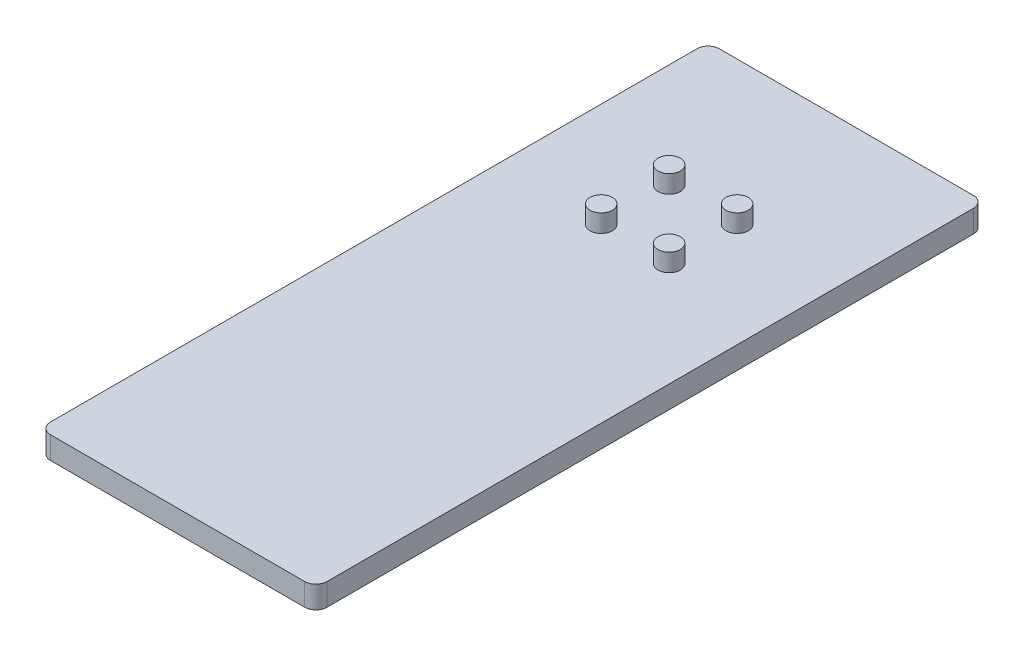
ISO-10303-21;
HEADER;
FILE_DESCRIPTION(('STEP AP214'),'2;1');
FILE_NAME('part.step','',(''),(''),'','','');
FILE_SCHEMA(('AUTOMOTIVE_DESIGN { 1 0 10303 214 1 1 1 1 }'));
ENDSEC;
DATA;
#1=APPLICATION_CONTEXT('core data for automotive mechanical design processes');
#2=APPLICATION_PROTOCOL_DEFINITION('international standard','automotive_design',2000,#1);
#3=PRODUCT_CONTEXT('',#1,'mechanical');
#4=PRODUCT('Part','Part','',(#3));
#5=PRODUCT_RELATED_PRODUCT_CATEGORY('part','',(#4));
#6=PRODUCT_DEFINITION_FORMATION('','',#4);
#7=PRODUCT_DEFINITION_CONTEXT('part definition',#1,'design');
#8=PRODUCT_DEFINITION('design','',#6,#7);
#9=PRODUCT_DEFINITION_SHAPE('','',#8);
#10=(LENGTH_UNIT() NAMED_UNIT(*) SI_UNIT(.MILLI.,.METRE.));
#11=(NAMED_UNIT(*) PLANE_ANGLE_UNIT() SI_UNIT($,.RADIAN.));
#12=(NAMED_UNIT(*) SI_UNIT($,.STERADIAN.) SOLID_ANGLE_UNIT());
#13=UNCERTAINTY_MEASURE_WITH_UNIT(LENGTH_MEASURE(1.E-05),#10,'distance_accuracy_value','');
#14=(GEOMETRIC_REPRESENTATION_CONTEXT(3) GLOBAL_UNCERTAINTY_ASSIGNED_CONTEXT((#13)) GLOBAL_UNIT_ASSIGNED_CONTEXT((#10,
#11,#12)) REPRESENTATION_CONTEXT('',''));
#15=CARTESIAN_POINT('',(0.,0.,0.));
#16=DIRECTION('',(0.,0.,1.));
#17=DIRECTION('',(1.,0.,0.));
#18=AXIS2_PLACEMENT_3D('',#15,#16,#17);
#19=CARTESIAN_POINT('',(31.,5.,-75.0000000000002));
#20=DIRECTION('',(-1.,0.,0.));
#21=DIRECTION('',(0.,0.,1.));
#22=AXIS2_PLACEMENT_3D('',#19,#20,#21);
#23=PLANE('',#22);
#24=DIRECTION('',(0.,0.,-1.));
#25=VECTOR('',#24,1.);
#26=CARTESIAN_POINT('',(31.,0.,-75.0000000000002));
#27=LINE('',#26,#25);
#28=CARTESIAN_POINT('',(30.9999999999999,0.,72.4999999999998));
#29=VERTEX_POINT('',#28);
#30=CARTESIAN_POINT('',(31.,0.,-72.5000000000001));
#31=VERTEX_POINT('',#30);
#32=EDGE_CURVE('E146',#29,#31,#27,.T.);
#33=ORIENTED_EDGE('',*,*,#32,.T.);
#34=DIRECTION('',(0.,-1.,0.));
#35=VECTOR('',#34,1.);
#36=CARTESIAN_POINT('',(31.,5.,-72.5000000000001));
#37=LINE('',#36,#35);
#38=CARTESIAN_POINT('',(31.,5.,-72.5000000000001));
#39=VERTEX_POINT('',#38);
#40=EDGE_CURVE('E180',#31,#39,#37,.F.);
#41=ORIENTED_EDGE('',*,*,#40,.T.);
#42=DIRECTION('',(0.,0.,-1.));
#43=VECTOR('',#42,1.);
#44=CARTESIAN_POINT('',(31.,5.,-75.0000000000002));
#45=LINE('',#44,#43);
#46=CARTESIAN_POINT('',(30.9999999999999,5.,72.4999999999998));
#47=VERTEX_POINT('',#46);
#48=EDGE_CURVE('E144',#47,#39,#45,.T.);
#49=ORIENTED_EDGE('',*,*,#48,.F.);
#50=DIRECTION('',(0.,-1.,0.));
#51=VECTOR('',#50,1.);
#52=CARTESIAN_POINT('',(30.9999999999999,5.,72.4999999999998));
#53=LINE('',#52,#51);
#54=EDGE_CURVE('E176',#47,#29,#53,.T.);
#55=ORIENTED_EDGE('',*,*,#54,.T.);
#56=EDGE_LOOP('',(#33,#41,#49,#55));
#57=FACE_BOUND('',#56,.T.);
#58=ADVANCED_FACE('F45',(#57),#23,.F.);
#59=CARTESIAN_POINT('',(-31.0000000000001,5.,-75.0000000000002));
#60=DIRECTION('',(0.,0.,1.));
#61=DIRECTION('',(1.,0.,0.));
#62=AXIS2_PLACEMENT_3D('',#59,#60,#61);
#63=PLANE('',#62);
#64=DIRECTION('',(-1.,0.,0.));
#65=VECTOR('',#64,1.);
#66=CARTESIAN_POINT('',(-31.0000000000001,0.,-75.0000000000002));
#67=LINE('',#66,#65);
#68=CARTESIAN_POINT('',(28.5,0.,-75.0000000000002));
#69=VERTEX_POINT('',#68);
#70=CARTESIAN_POINT('',(-28.5000000000001,0.,-75.0000000000002));
#71=VERTEX_POINT('',#70);
#72=EDGE_CURVE('E140',#69,#71,#67,.T.);
#73=ORIENTED_EDGE('',*,*,#72,.T.);
#74=DIRECTION('',(0.,-1.,0.));
#75=VECTOR('',#74,1.);
#76=CARTESIAN_POINT('',(-28.5000000000001,5.,-75.0000000000002));
#77=LINE('',#76,#75);
#78=CARTESIAN_POINT('',(-28.5000000000001,5.,-75.0000000000002));
#79=VERTEX_POINT('',#78);
#80=EDGE_CURVE('E116',#71,#79,#77,.F.);
#81=ORIENTED_EDGE('',*,*,#80,.T.);
#82=DIRECTION('',(-1.,0.,0.));
#83=VECTOR('',#82,1.);
#84=CARTESIAN_POINT('',(-31.0000000000001,5.,-75.0000000000002));
#85=LINE('',#84,#83);
#86=CARTESIAN_POINT('',(28.5,5.,-75.0000000000002));
#87=VERTEX_POINT('',#86);
#88=EDGE_CURVE('E199',#87,#79,#85,.T.);
#89=ORIENTED_EDGE('',*,*,#88,.F.);
#90=DIRECTION('',(0.,-1.,0.));
#91=VECTOR('',#90,1.);
#92=CARTESIAN_POINT('',(28.5,5.,-75.0000000000002));
#93=LINE('',#92,#91);
#94=EDGE_CURVE('E122',#87,#69,#93,.T.);
#95=ORIENTED_EDGE('',*,*,#94,.T.);
#96=EDGE_LOOP('',(#73,#81,#89,#95));
#97=FACE_BOUND('',#96,.T.);
#98=ADVANCED_FACE('F256',(#97),#63,.F.);
#99=CARTESIAN_POINT('',(-31.0000000000001,5.,-75.0000000000002));
#100=DIRECTION('',(1.,0.,0.));
#101=DIRECTION('',(0.,0.,-1.));
#102=AXIS2_PLACEMENT_3D('',#99,#100,#101);
#103=PLANE('',#102);
#104=DIRECTION('',(0.,0.,1.));
#105=VECTOR('',#104,1.);
#106=CARTESIAN_POINT('',(-31.0000000000001,5.,-75.0000000000002));
#107=LINE('',#106,#105);
#108=CARTESIAN_POINT('',(-31.0000000000001,5.,-72.5000000000001));
#109=VERTEX_POINT('',#108);
#110=CARTESIAN_POINT('',(-31.0000000000001,5.,72.4999999999998));
#111=VERTEX_POINT('',#110);
#112=EDGE_CURVE('E131',#109,#111,#107,.T.);
#113=ORIENTED_EDGE('',*,*,#112,.F.);
#114=DIRECTION('',(0.,-1.,0.));
#115=VECTOR('',#114,1.);
#116=CARTESIAN_POINT('',(-31.0000000000001,5.,-72.5000000000001));
#117=LINE('',#116,#115);
#118=CARTESIAN_POINT('',(-31.0000000000001,0.,-72.5000000000001));
#119=VERTEX_POINT('',#118);
#120=EDGE_CURVE('E115',#109,#119,#117,.T.);
#121=ORIENTED_EDGE('',*,*,#120,.T.);
#122=DIRECTION('',(0.,0.,1.));
#123=VECTOR('',#122,1.);
#124=CARTESIAN_POINT('',(-31.0000000000001,0.,-75.0000000000002));
#125=LINE('',#124,#123);
#126=CARTESIAN_POINT('',(-31.0000000000001,0.,72.4999999999998));
#127=VERTEX_POINT('',#126);
#128=EDGE_CURVE('E129',#119,#127,#125,.T.);
#129=ORIENTED_EDGE('',*,*,#128,.T.);
#130=DIRECTION('',(0.,-1.,0.));
#131=VECTOR('',#130,1.);
#132=CARTESIAN_POINT('',(-31.0000000000001,5.,72.4999999999998));
#133=LINE('',#132,#131);
#134=EDGE_CURVE('E134',#127,#111,#133,.F.);
#135=ORIENTED_EDGE('',*,*,#134,.T.);
#136=EDGE_LOOP('',(#113,#121,#129,#135));
#137=FACE_BOUND('',#136,.T.);
#138=ADVANCED_FACE('F128',(#137),#103,.F.);
#139=CARTESIAN_POINT('',(-31.0000000000001,5.,74.9999999999998));
#140=DIRECTION('',(0.,0.,-1.));
#141=DIRECTION('',(-1.,0.,0.));
#142=AXIS2_PLACEMENT_3D('',#139,#140,#141);
#143=PLANE('',#142);
#144=DIRECTION('',(1.,0.,0.));
#145=VECTOR('',#144,1.);
#146=CARTESIAN_POINT('',(-31.0000000000001,0.,74.9999999999998));
#147=LINE('',#146,#145);
#148=CARTESIAN_POINT('',(-28.5000000000001,0.,74.9999999999998));
#149=VERTEX_POINT('',#148);
#150=CARTESIAN_POINT('',(28.4999999999999,0.,74.9999999999998));
#151=VERTEX_POINT('',#150);
#152=EDGE_CURVE('E139',#149,#151,#147,.T.);
#153=ORIENTED_EDGE('',*,*,#152,.T.);
#154=DIRECTION('',(0.,-1.,0.));
#155=VECTOR('',#154,1.);
#156=CARTESIAN_POINT('',(28.4999999999999,5.,74.9999999999998));
#157=LINE('',#156,#155);
#158=CARTESIAN_POINT('',(28.4999999999999,5.,74.9999999999998));
#159=VERTEX_POINT('',#158);
#160=EDGE_CURVE('E11',#151,#159,#157,.F.);
#161=ORIENTED_EDGE('',*,*,#160,.T.);
#162=DIRECTION('',(1.,0.,0.));
#163=VECTOR('',#162,1.);
#164=CARTESIAN_POINT('',(-31.0000000000001,5.,74.9999999999998));
#165=LINE('',#164,#163);
#166=CARTESIAN_POINT('',(-28.5000000000001,5.,74.9999999999998));
#167=VERTEX_POINT('',#166);
#168=EDGE_CURVE('E151',#167,#159,#165,.T.);
#169=ORIENTED_EDGE('',*,*,#168,.F.);
#170=DIRECTION('',(0.,-1.,0.));
#171=VECTOR('',#170,1.);
#172=CARTESIAN_POINT('',(-28.5000000000001,5.,74.9999999999998));
#173=LINE('',#172,#171);
#174=EDGE_CURVE('E54',#167,#149,#173,.T.);
#175=ORIENTED_EDGE('',*,*,#174,.T.);
#176=EDGE_LOOP('',(#153,#161,#169,#175));
#177=FACE_BOUND('',#176,.T.);
#178=ADVANCED_FACE('F185',(#177),#143,.F.);
#179=CARTESIAN_POINT('',(0.,5.,0.));
#180=DIRECTION('',(0.,1.,0.));
#181=DIRECTION('',(0.,0.,1.));
#182=AXIS2_PLACEMENT_3D('',#179,#180,#181);
#183=PLANE('',#182);
#184=CARTESIAN_POINT('',(-7.62499999999967,5.,-27.6250000000005));
#185=DIRECTION('',(0.,1.,0.));
#186=DIRECTION('',(0.,0.,1.));
#187=AXIS2_PLACEMENT_3D('',#184,#185,#186);
#188=CIRCLE('',#187,2.5);
#189=CARTESIAN_POINT('',(-7.62499999999967,5.,-25.1250000000005));
#190=VERTEX_POINT('',#189);
#191=EDGE_CURVE('E225',#190,#190,#188,.T.);
#192=ORIENTED_EDGE('',*,*,#191,.F.);
#193=EDGE_LOOP('',(#192));
#194=FACE_BOUND('',#193,.T.);
#195=CARTESIAN_POINT('',(7.62499999999972,5.,-27.6250000000003));
#196=DIRECTION('',(0.,1.,0.));
#197=DIRECTION('',(0.,0.,1.));
#198=AXIS2_PLACEMENT_3D('',#195,#196,#197);
#199=CIRCLE('',#198,2.49999999999945);
#200=CARTESIAN_POINT('',(7.62499999999972,5.,-25.1250000000009));
#201=VERTEX_POINT('',#200);
#202=EDGE_CURVE('E233',#201,#201,#199,.T.);
#203=ORIENTED_EDGE('',*,*,#202,.F.);
#204=EDGE_LOOP('',(#203));
#205=FACE_BOUND('',#204,.T.);
#206=CARTESIAN_POINT('',(7.62499999999984,5.,-42.8750000000006));
#207=DIRECTION('',(0.,1.,0.));
#208=DIRECTION('',(0.,0.,1.));
#209=AXIS2_PLACEMENT_3D('',#206,#207,#208);
#210=CIRCLE('',#209,2.5);
#211=CARTESIAN_POINT('',(7.62499999999984,5.,-40.3750000000006));
#212=VERTEX_POINT('',#211);
#213=EDGE_CURVE('E219',#212,#212,#210,.T.);
#214=ORIENTED_EDGE('',*,*,#213,.F.);
#215=EDGE_LOOP('',(#214));
#216=FACE_BOUND('',#215,.T.);
#217=CARTESIAN_POINT('',(-7.625,5.,-42.8750000000002));
#218=DIRECTION('',(0.,1.,0.));
#219=DIRECTION('',(0.,0.,1.));
#220=AXIS2_PLACEMENT_3D('',#217,#218,#219);
#221=CIRCLE('',#220,2.5);
#222=CARTESIAN_POINT('',(-7.625,5.,-40.3750000000002));
#223=VERTEX_POINT('',#222);
#224=EDGE_CURVE('E205',#223,#223,#221,.T.);
#225=ORIENTED_EDGE('',*,*,#224,.F.);
#226=EDGE_LOOP('',(#225));
#227=FACE_BOUND('',#226,.T.);
#228=ORIENTED_EDGE('',*,*,#88,.T.);
#229=CARTESIAN_POINT('',(-28.5000000000001,5.,-72.5000000000001));
#230=DIRECTION('',(0.,1.,0.));
#231=DIRECTION('',(0.,0.,1.));
#232=AXIS2_PLACEMENT_3D('',#229,#230,#231);
#233=CIRCLE('',#232,2.5);
#234=EDGE_CURVE('E173',#79,#109,#233,.T.);
#235=ORIENTED_EDGE('',*,*,#234,.T.);
#236=ORIENTED_EDGE('',*,*,#112,.T.);
#237=CARTESIAN_POINT('',(-28.5000000000001,5.,72.4999999999998));
#238=DIRECTION('',(0.,1.,0.));
#239=DIRECTION('',(0.,0.,1.));
#240=AXIS2_PLACEMENT_3D('',#237,#238,#239);
#241=CIRCLE('',#240,2.5);
#242=EDGE_CURVE('E66',#111,#167,#241,.T.);
#243=ORIENTED_EDGE('',*,*,#242,.T.);
#244=ORIENTED_EDGE('',*,*,#168,.T.);
#245=CARTESIAN_POINT('',(28.4999999999999,5.,72.4999999999998));
#246=DIRECTION('',(0.,1.,0.));
#247=DIRECTION('',(0.,0.,1.));
#248=AXIS2_PLACEMENT_3D('',#245,#246,#247);
#249=CIRCLE('',#248,2.5);
#250=EDGE_CURVE('E167',#159,#47,#249,.T.);
#251=ORIENTED_EDGE('',*,*,#250,.T.);
#252=ORIENTED_EDGE('',*,*,#48,.T.);
#253=CARTESIAN_POINT('',(28.5,5.,-72.5000000000001));
#254=DIRECTION('',(0.,1.,0.));
#255=DIRECTION('',(0.,0.,1.));
#256=AXIS2_PLACEMENT_3D('',#253,#254,#255);
#257=CIRCLE('',#256,2.5);
#258=EDGE_CURVE('E170',#39,#87,#257,.T.);
#259=ORIENTED_EDGE('',*,*,#258,.T.);
#260=EDGE_LOOP('',(#228,#235,#236,#243,#244,#251,#252,#259));
#261=FACE_BOUND('',#260,.T.);
#262=ADVANCED_FACE('F247',(#194,#205,#216,#227,#261),#183,.T.);
#263=CARTESIAN_POINT('',(0.,0.,0.));
#264=DIRECTION('',(0.,1.,0.));
#265=DIRECTION('',(0.,0.,1.));
#266=AXIS2_PLACEMENT_3D('',#263,#264,#265);
#267=PLANE('',#266);
#268=ORIENTED_EDGE('',*,*,#128,.F.);
#269=CARTESIAN_POINT('',(-28.5000000000001,0.,-72.5000000000001));
#270=DIRECTION('',(0.,1.,0.));
#271=DIRECTION('',(0.,0.,1.));
#272=AXIS2_PLACEMENT_3D('',#269,#270,#271);
#273=CIRCLE('',#272,2.5);
#274=EDGE_CURVE('E111',#119,#71,#273,.F.);
#275=ORIENTED_EDGE('',*,*,#274,.T.);
#276=ORIENTED_EDGE('',*,*,#72,.F.);
#277=CARTESIAN_POINT('',(28.5,0.,-72.5000000000001));
#278=DIRECTION('',(0.,1.,0.));
#279=DIRECTION('',(0.,0.,1.));
#280=AXIS2_PLACEMENT_3D('',#277,#278,#279);
#281=CIRCLE('',#280,2.5);
#282=EDGE_CURVE('E123',#69,#31,#281,.F.);
#283=ORIENTED_EDGE('',*,*,#282,.T.);
#284=ORIENTED_EDGE('',*,*,#32,.F.);
#285=CARTESIAN_POINT('',(28.4999999999999,0.,72.4999999999998));
#286=DIRECTION('',(0.,1.,0.));
#287=DIRECTION('',(0.,0.,1.));
#288=AXIS2_PLACEMENT_3D('',#285,#286,#287);
#289=CIRCLE('',#288,2.5);
#290=EDGE_CURVE('E155',#29,#151,#289,.F.);
#291=ORIENTED_EDGE('',*,*,#290,.T.);
#292=ORIENTED_EDGE('',*,*,#152,.F.);
#293=CARTESIAN_POINT('',(-28.5000000000001,0.,72.4999999999998));
#294=DIRECTION('',(0.,1.,0.));
#295=DIRECTION('',(0.,0.,1.));
#296=AXIS2_PLACEMENT_3D('',#293,#294,#295);
#297=CIRCLE('',#296,2.5);
#298=EDGE_CURVE('E133',#149,#127,#297,.F.);
#299=ORIENTED_EDGE('',*,*,#298,.T.);
#300=EDGE_LOOP('',(#268,#275,#276,#283,#284,#291,#292,#299));
#301=FACE_BOUND('',#300,.T.);
#302=ADVANCED_FACE('F136',(#301),#267,.F.);
#303=CARTESIAN_POINT('',(-28.5000000000001,5.,-72.5000000000001));
#304=DIRECTION('',(0.,-1.,0.));
#305=DIRECTION('',(0.,0.,-1.));
#306=AXIS2_PLACEMENT_3D('',#303,#304,#305);
#307=CYLINDRICAL_SURFACE('',#306,2.5);
#308=ORIENTED_EDGE('',*,*,#234,.F.);
#309=ORIENTED_EDGE('',*,*,#80,.F.);
#310=ORIENTED_EDGE('',*,*,#274,.F.);
#311=ORIENTED_EDGE('',*,*,#120,.F.);
#312=EDGE_LOOP('',(#308,#309,#310,#311));
#313=FACE_BOUND('',#312,.T.);
#314=ADVANCED_FACE('F114',(#313),#307,.T.);
#315=CARTESIAN_POINT('',(28.5,5.,-72.5000000000001));
#316=DIRECTION('',(0.,-1.,0.));
#317=DIRECTION('',(0.,0.,-1.));
#318=AXIS2_PLACEMENT_3D('',#315,#316,#317);
#319=CYLINDRICAL_SURFACE('',#318,2.5);
#320=ORIENTED_EDGE('',*,*,#258,.F.);
#321=ORIENTED_EDGE('',*,*,#40,.F.);
#322=ORIENTED_EDGE('',*,*,#282,.F.);
#323=ORIENTED_EDGE('',*,*,#94,.F.);
#324=EDGE_LOOP('',(#320,#321,#322,#323));
#325=FACE_BOUND('',#324,.T.);
#326=ADVANCED_FACE('F258',(#325),#319,.T.);
#327=CARTESIAN_POINT('',(28.4999999999999,5.,72.4999999999998));
#328=DIRECTION('',(0.,-1.,0.));
#329=DIRECTION('',(0.,0.,-1.));
#330=AXIS2_PLACEMENT_3D('',#327,#328,#329);
#331=CYLINDRICAL_SURFACE('',#330,2.5);
#332=ORIENTED_EDGE('',*,*,#250,.F.);
#333=ORIENTED_EDGE('',*,*,#160,.F.);
#334=ORIENTED_EDGE('',*,*,#290,.F.);
#335=ORIENTED_EDGE('',*,*,#54,.F.);
#336=EDGE_LOOP('',(#332,#333,#334,#335));
#337=FACE_BOUND('',#336,.T.);
#338=ADVANCED_FACE('F192',(#337),#331,.T.);
#339=CARTESIAN_POINT('',(-28.5000000000001,5.,72.4999999999998));
#340=DIRECTION('',(0.,-1.,0.));
#341=DIRECTION('',(0.,0.,-1.));
#342=AXIS2_PLACEMENT_3D('',#339,#340,#341);
#343=CYLINDRICAL_SURFACE('',#342,2.5);
#344=ORIENTED_EDGE('',*,*,#242,.F.);
#345=ORIENTED_EDGE('',*,*,#134,.F.);
#346=ORIENTED_EDGE('',*,*,#298,.F.);
#347=ORIENTED_EDGE('',*,*,#174,.F.);
#348=EDGE_LOOP('',(#344,#345,#346,#347));
#349=FACE_BOUND('',#348,.T.);
#350=ADVANCED_FACE('F47',(#349),#343,.T.);
#351=CARTESIAN_POINT('',(-7.625,9.,-42.8750000000002));
#352=DIRECTION('',(0.,-1.,0.));
#353=DIRECTION('',(0.,0.,-1.));
#354=AXIS2_PLACEMENT_3D('',#351,#352,#353);
#355=CYLINDRICAL_SURFACE('',#354,2.5);
#356=CARTESIAN_POINT('',(-7.625,9.,-42.8750000000002));
#357=DIRECTION('',(0.,1.,0.));
#358=DIRECTION('',(0.,0.,1.));
#359=AXIS2_PLACEMENT_3D('',#356,#357,#358);
#360=CIRCLE('',#359,2.5);
#361=CARTESIAN_POINT('',(-7.625,9.,-40.3750000000002));
#362=VERTEX_POINT('',#361);
#363=EDGE_CURVE('E212',#362,#362,#360,.T.);
#364=ORIENTED_EDGE('',*,*,#363,.F.);
#365=EDGE_LOOP('',(#364));
#366=FACE_BOUND('',#365,.T.);
#367=ORIENTED_EDGE('',*,*,#224,.T.);
#368=EDGE_LOOP('',(#367));
#369=FACE_BOUND('',#368,.T.);
#370=ADVANCED_FACE('F279',(#366,#369),#355,.T.);
#371=CARTESIAN_POINT('',(-7.625,9.,-42.8750000000002));
#372=DIRECTION('',(0.,1.,0.));
#373=DIRECTION('',(0.,0.,1.));
#374=AXIS2_PLACEMENT_3D('',#371,#372,#373);
#375=PLANE('',#374);
#376=ORIENTED_EDGE('',*,*,#363,.T.);
#377=EDGE_LOOP('',(#376));
#378=FACE_BOUND('',#377,.T.);
#379=ADVANCED_FACE('F282',(#378),#375,.T.);
#380=CARTESIAN_POINT('',(7.62499999999984,9.,-42.8750000000006));
#381=DIRECTION('',(0.,-1.,0.));
#382=DIRECTION('',(0.,0.,-1.));
#383=AXIS2_PLACEMENT_3D('',#380,#381,#382);
#384=CYLINDRICAL_SURFACE('',#383,2.5);
#385=CARTESIAN_POINT('',(7.62499999999984,9.,-42.8750000000006));
#386=DIRECTION('',(0.,1.,0.));
#387=DIRECTION('',(0.,0.,1.));
#388=AXIS2_PLACEMENT_3D('',#385,#386,#387);
#389=CIRCLE('',#388,2.5);
#390=CARTESIAN_POINT('',(7.62499999999984,9.,-40.3750000000006));
#391=VERTEX_POINT('',#390);
#392=EDGE_CURVE('E237',#391,#391,#389,.T.);
#393=ORIENTED_EDGE('',*,*,#392,.F.);
#394=EDGE_LOOP('',(#393));
#395=FACE_BOUND('',#394,.T.);
#396=ORIENTED_EDGE('',*,*,#213,.T.);
#397=EDGE_LOOP('',(#396));
#398=FACE_BOUND('',#397,.T.);
#399=ADVANCED_FACE('F245',(#395,#398),#384,.T.);
#400=CARTESIAN_POINT('',(7.62499999999984,9.,-42.8750000000006));
#401=DIRECTION('',(0.,1.,0.));
#402=DIRECTION('',(0.,0.,1.));
#403=AXIS2_PLACEMENT_3D('',#400,#401,#402);
#404=PLANE('',#403);
#405=ORIENTED_EDGE('',*,*,#392,.T.);
#406=EDGE_LOOP('',(#405));
#407=FACE_BOUND('',#406,.T.);
#408=ADVANCED_FACE('F301',(#407),#404,.T.);
#409=CARTESIAN_POINT('',(7.62499999999972,9.,-27.6250000000003));
#410=DIRECTION('',(0.,-1.,0.));
#411=DIRECTION('',(0.,0.,-1.));
#412=AXIS2_PLACEMENT_3D('',#409,#410,#411);
#413=CYLINDRICAL_SURFACE('',#412,2.49999999999945);
#414=CARTESIAN_POINT('',(7.62499999999972,9.,-27.6250000000003));
#415=DIRECTION('',(0.,1.,0.));
#416=DIRECTION('',(0.,0.,1.));
#417=AXIS2_PLACEMENT_3D('',#414,#415,#416);
#418=CIRCLE('',#417,2.49999999999945);
#419=CARTESIAN_POINT('',(7.62499999999972,9.,-25.1250000000009));
#420=VERTEX_POINT('',#419);
#421=EDGE_CURVE('E229',#420,#420,#418,.T.);
#422=ORIENTED_EDGE('',*,*,#421,.F.);
#423=EDGE_LOOP('',(#422));
#424=FACE_BOUND('',#423,.T.);
#425=ORIENTED_EDGE('',*,*,#202,.T.);
#426=EDGE_LOOP('',(#425));
#427=FACE_BOUND('',#426,.T.);
#428=ADVANCED_FACE('F297',(#424,#427),#413,.T.);
#429=CARTESIAN_POINT('',(7.62499999999972,9.,-27.6250000000003));
#430=DIRECTION('',(0.,1.,0.));
#431=DIRECTION('',(0.,0.,1.));
#432=AXIS2_PLACEMENT_3D('',#429,#430,#431);
#433=PLANE('',#432);
#434=ORIENTED_EDGE('',*,*,#421,.T.);
#435=EDGE_LOOP('',(#434));
#436=FACE_BOUND('',#435,.T.);
#437=ADVANCED_FACE('F293',(#436),#433,.T.);
#438=CARTESIAN_POINT('',(-7.62499999999967,9.,-27.6250000000005));
#439=DIRECTION('',(0.,-1.,0.));
#440=DIRECTION('',(0.,0.,-1.));
#441=AXIS2_PLACEMENT_3D('',#438,#439,#440);
#442=CYLINDRICAL_SURFACE('',#441,2.5);
#443=CARTESIAN_POINT('',(-7.62499999999967,9.,-27.6250000000005));
#444=DIRECTION('',(0.,1.,0.));
#445=DIRECTION('',(0.,0.,1.));
#446=AXIS2_PLACEMENT_3D('',#443,#444,#445);
#447=CIRCLE('',#446,2.5);
#448=CARTESIAN_POINT('',(-7.62499999999967,9.,-25.1250000000005));
#449=VERTEX_POINT('',#448);
#450=EDGE_CURVE('E221',#449,#449,#447,.T.);
#451=ORIENTED_EDGE('',*,*,#450,.F.);
#452=EDGE_LOOP('',(#451));
#453=FACE_BOUND('',#452,.T.);
#454=ORIENTED_EDGE('',*,*,#191,.T.);
#455=EDGE_LOOP('',(#454));
#456=FACE_BOUND('',#455,.T.);
#457=ADVANCED_FACE('F289',(#453,#456),#442,.T.);
#458=CARTESIAN_POINT('',(-7.62499999999967,9.,-27.6250000000005));
#459=DIRECTION('',(0.,1.,0.));
#460=DIRECTION('',(0.,0.,1.));
#461=AXIS2_PLACEMENT_3D('',#458,#459,#460);
#462=PLANE('',#461);
#463=ORIENTED_EDGE('',*,*,#450,.T.);
#464=EDGE_LOOP('',(#463));
#465=FACE_BOUND('',#464,.T.);
#466=ADVANCED_FACE('F286',(#465),#462,.T.);
#467=CLOSED_SHELL('',(#58,#98,#138,#178,#262,#302,#314,#326,#338,#350,#370,#379,#399,#408,#428,
#437,#457,#466));
#468=MANIFOLD_SOLID_BREP('B2',#467);
#469=ADVANCED_BREP_SHAPE_REPRESENTATION('',(#18,#468),#14);
#470=SHAPE_DEFINITION_REPRESENTATION(#9,#469);
ENDSEC;
END-ISO-10303-21;
